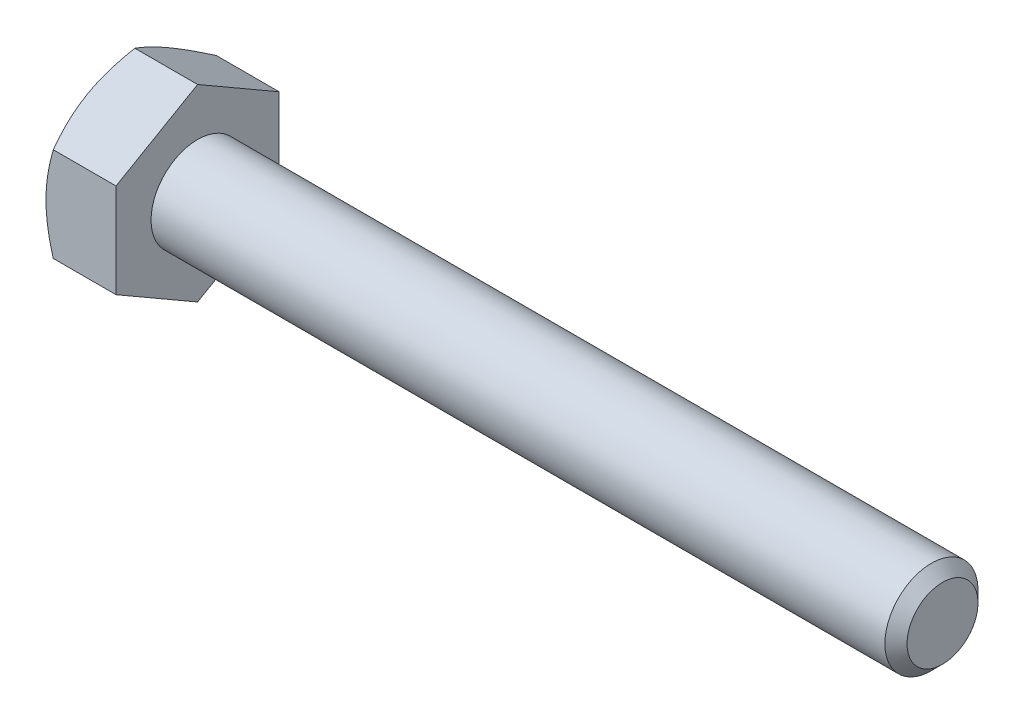
ISO-10303-21;
HEADER;
FILE_DESCRIPTION(('STEP AP214'),'2;1');
FILE_NAME('part.step','',(''),(''),'','','');
FILE_SCHEMA(('AUTOMOTIVE_DESIGN { 1 0 10303 214 1 1 1 1 }'));
ENDSEC;
DATA;
#1=APPLICATION_CONTEXT('core data for automotive mechanical design processes');
#2=APPLICATION_PROTOCOL_DEFINITION('international standard','automotive_design',2000,#1);
#3=PRODUCT_CONTEXT('',#1,'mechanical');
#4=PRODUCT('Part','Part','',(#3));
#5=PRODUCT_RELATED_PRODUCT_CATEGORY('part','',(#4));
#6=PRODUCT_DEFINITION_FORMATION('','',#4);
#7=PRODUCT_DEFINITION_CONTEXT('part definition',#1,'design');
#8=PRODUCT_DEFINITION('design','',#6,#7);
#9=PRODUCT_DEFINITION_SHAPE('','',#8);
#10=(LENGTH_UNIT() NAMED_UNIT(*) SI_UNIT(.MILLI.,.METRE.));
#11=(NAMED_UNIT(*) PLANE_ANGLE_UNIT() SI_UNIT($,.RADIAN.));
#12=(NAMED_UNIT(*) SI_UNIT($,.STERADIAN.) SOLID_ANGLE_UNIT());
#13=UNCERTAINTY_MEASURE_WITH_UNIT(LENGTH_MEASURE(1.E-05),#10,'distance_accuracy_value','');
#14=(GEOMETRIC_REPRESENTATION_CONTEXT(3) GLOBAL_UNCERTAINTY_ASSIGNED_CONTEXT((#13)) GLOBAL_UNIT_ASSIGNED_CONTEXT((#10,
#11,#12)) REPRESENTATION_CONTEXT('',''));
#15=CARTESIAN_POINT('',(0.,0.,0.));
#16=DIRECTION('',(0.,0.,1.));
#17=DIRECTION('',(1.,0.,0.));
#18=AXIS2_PLACEMENT_3D('',#15,#16,#17);
#19=CARTESIAN_POINT('',(4.7752,3.21156860739422,-5.5626));
#20=DIRECTION('',(0.,-0.866025403784438,0.500000000000001));
#21=DIRECTION('',(0.,-0.500000000000001,-0.866025403784438));
#22=AXIS2_PLACEMENT_3D('',#19,#20,#21);
#23=PLANE('',#22);
#24=CARTESIAN_POINT('',(0.496898061070141,6.42325268484227,0.000200000000000224));
#25=CARTESIAN_POINT('',(0.456146202255129,6.35265858120791,-0.12207257420949));
#26=CARTESIAN_POINT('',(0.417243775308722,6.2818012683745,-0.244801040124762));
#27=CARTESIAN_POINT('',(0.343647161560542,6.13951120287094,-0.491254662989243));
#28=CARTESIAN_POINT('',(0.308954790139044,6.06807821602766,-0.614980225538197));
#29=CARTESIAN_POINT('',(0.211873701066856,5.8526355064814,-0.98813794459262));
#30=CARTESIAN_POINT('',(0.156654841923375,5.7077753520137,-1.23904309212296));
#31=CARTESIAN_POINT('',(0.0919037861815303,5.49099476252076,-1.61451808721945));
#32=CARTESIAN_POINT('',(0.0734579983429364,5.419722058732,-1.7379660313744));
#33=CARTESIAN_POINT('',(0.0425268916674649,5.27685459691415,-1.98541973399132));
#34=CARTESIAN_POINT('',(0.0300410461890113,5.20525986790489,-2.10942544218948));
#35=CARTESIAN_POINT('',(0.011348029939474,5.06194605565758,-2.35765224642821));
#36=CARTESIAN_POINT('',(0.00513373340585016,4.99022720650591,-2.48187293701927));
#37=CARTESIAN_POINT('',(-0.000889599359092401,4.84672720555796,-2.7304222295473));
#38=CARTESIAN_POINT('',(-0.000698833448292997,4.7749460557547,-2.85475082803225));
#39=CARTESIAN_POINT('',(0.00862810136342634,4.57828637012707,-3.19537539533985));
#40=CARTESIAN_POINT('',(0.0242873955350792,4.45347220138351,-3.41155987710816));
#41=CARTESIAN_POINT('',(0.0739443233816081,4.20467287416474,-3.84249295274001));
#42=CARTESIAN_POINT('',(0.10795893142346,4.08068859075412,-4.05724003094723));
#43=CARTESIAN_POINT('',(0.192986041409678,3.83138850679899,-4.4890404426887));
#44=CARTESIAN_POINT('',(0.244358813937402,3.70610416511177,-4.70603928788379));
#45=CARTESIAN_POINT('',(0.360954456999593,3.45740388365366,-5.13680081122591));
#46=CARTESIAN_POINT('',(0.426149937617057,3.33398475856358,-5.35056900650764));
#47=CARTESIAN_POINT('',(0.496898061070136,3.21145313734038,-5.5628));
#48=B_SPLINE_CURVE_WITH_KNOTS('',3,(#24,#25,#26,#27,#28,#29,#30,#31,#32,#33,#34,#35,#36,#37,#38,
#39,#40,#41,#42,#43,#44,#45,#46,#47),.UNSPECIFIED.,.F.,.F.,(4,2,2,2,2,2,2,2,2,2,2,4),(0.,
0.44082011856227,0.881829648847399,1.76568130465016,2.19678242164486,2.62784543796583,
3.05841812523868,3.48897751176353,4.23854798324166,4.98881282275669,5.75571809391027,
6.52111769989992),.UNSPECIFIED.);
#49=CARTESIAN_POINT('',(0.496831392605786,6.42313721478843,0.));
#50=VERTEX_POINT('',#49);
#51=CARTESIAN_POINT('',(0.,4.81735291109132,-2.7813));
#52=VERTEX_POINT('',#51);
#53=EDGE_CURVE('E47',#50,#52,#48,.T.);
#54=ORIENTED_EDGE('',*,*,#53,.F.);
#55=DIRECTION('',(-1.,0.,0.));
#56=VECTOR('',#55,1.);
#57=CARTESIAN_POINT('',(4.7752,6.42313721478843,0.));
#58=LINE('',#57,#56);
#59=CARTESIAN_POINT('',(4.7752,6.42313721478843,0.));
#60=VERTEX_POINT('',#59);
#61=EDGE_CURVE('E143',#60,#50,#58,.T.);
#62=ORIENTED_EDGE('',*,*,#61,.F.);
#63=DIRECTION('',(0.,0.500000000000001,0.866025403784438));
#64=VECTOR('',#63,1.);
#65=CARTESIAN_POINT('',(4.7752,3.21156860739422,-5.5626));
#66=LINE('',#65,#64);
#67=CARTESIAN_POINT('',(4.7752,3.21156860739422,-5.5626));
#68=VERTEX_POINT('',#67);
#69=EDGE_CURVE('E228',#68,#60,#66,.T.);
#70=ORIENTED_EDGE('',*,*,#69,.F.);
#71=DIRECTION('',(-1.,0.,0.));
#72=VECTOR('',#71,1.);
#73=CARTESIAN_POINT('',(4.7752,3.21156860739422,-5.5626));
#74=LINE('',#73,#72);
#75=CARTESIAN_POINT('',(0.496831392605782,3.21156860739422,-5.5626));
#76=VERTEX_POINT('',#75);
#77=EDGE_CURVE('E131',#68,#76,#74,.T.);
#78=ORIENTED_EDGE('',*,*,#77,.T.);
#79=EDGE_CURVE('E125',#52,#76,#48,.T.);
#80=ORIENTED_EDGE('',*,*,#79,.F.);
#81=EDGE_LOOP('',(#54,#62,#70,#78,#80));
#82=FACE_BOUND('',#81,.T.);
#83=ADVANCED_FACE('F31',(#82),#23,.F.);
#84=CARTESIAN_POINT('',(4.7752,6.42313721478843,0.));
#85=DIRECTION('',(0.,-0.866025403784438,-0.500000000000002));
#86=DIRECTION('',(0.,0.500000000000002,-0.866025403784438));
#87=AXIS2_PLACEMENT_3D('',#84,#85,#86);
#88=PLANE('',#87);
#89=CARTESIAN_POINT('',(0.496898061070133,3.21145313734037,5.5628));
#90=CARTESIAN_POINT('',(0.456146202255122,3.28204724097473,5.44052742579051));
#91=CARTESIAN_POINT('',(0.417243775308715,3.35290455380814,5.31779895987524));
#92=CARTESIAN_POINT('',(0.343647161560536,3.49519461931171,5.07134533701076));
#93=CARTESIAN_POINT('',(0.308954790139038,3.56662760615498,4.94761977446181));
#94=CARTESIAN_POINT('',(0.21187370106685,3.78207031570124,4.57446205540738));
#95=CARTESIAN_POINT('',(0.156654841923369,3.92693047016895,4.32355690787704));
#96=CARTESIAN_POINT('',(0.0919037861815255,4.14371105966188,3.94808191278055));
#97=CARTESIAN_POINT('',(0.073457998342932,4.21498376345064,3.82463396862561));
#98=CARTESIAN_POINT('',(0.042526891667461,4.35785122526849,3.57718026600868));
#99=CARTESIAN_POINT('',(0.0300410461890077,4.42944595427775,3.45317455781053));
#100=CARTESIAN_POINT('',(0.0113480299394706,4.57275976652506,3.2049477535718));
#101=CARTESIAN_POINT('',(0.00513373340584675,4.64447861567674,3.08072706298073));
#102=CARTESIAN_POINT('',(-0.000889599359095246,4.78797861662468,2.83217777045271));
#103=CARTESIAN_POINT('',(-0.000698833448295297,4.85975976642794,2.70784917196776));
#104=CARTESIAN_POINT('',(0.00862810136342491,5.05641945205558,2.36722460466016));
#105=CARTESIAN_POINT('',(0.0242873955350777,5.18123362079913,2.15104012289185));
#106=CARTESIAN_POINT('',(0.0739443233816072,5.4300329480179,1.72010704725999));
#107=CARTESIAN_POINT('',(0.10795893142346,5.55401723142852,1.50535996905278));
#108=CARTESIAN_POINT('',(0.192986041409679,5.80331731538365,1.07355955731131));
#109=CARTESIAN_POINT('',(0.244358813937404,5.92860165707088,0.856560712116215));
#110=CARTESIAN_POINT('',(0.360954456999596,6.17730193852899,0.425799188774085));
#111=CARTESIAN_POINT('',(0.426149937617062,6.30072106361907,0.212030993492364));
#112=CARTESIAN_POINT('',(0.49689806107014,6.42325268484227,-0.000200000000000132));
#113=B_SPLINE_CURVE_WITH_KNOTS('',3,(#89,#90,#91,#92,#93,#94,#95,#96,#97,#98,#99,#100,#101,#102,
#103,#104,#105,#106,#107,#108,#109,#110,#111,#112),.UNSPECIFIED.,.F.,.F.,(4,2,2,2,2,2,2,2,2,2,2,
4),(0.,0.440820118562269,0.881829648847397,1.76568130465016,2.19678242164486,2.62784543796582,
3.05841812523867,3.48897751176352,4.23854798324166,4.98881282275669,5.75571809391027,
6.52111769989993),.UNSPECIFIED.);
#114=CARTESIAN_POINT('',(0.496831392605779,3.21156860739421,5.5626));
#115=VERTEX_POINT('',#114);
#116=CARTESIAN_POINT('',(0.,4.81735291109131,2.78130000000001));
#117=VERTEX_POINT('',#116);
#118=EDGE_CURVE('E54',#115,#117,#113,.T.);
#119=ORIENTED_EDGE('',*,*,#118,.F.);
#120=DIRECTION('',(-1.,0.,0.));
#121=VECTOR('',#120,1.);
#122=CARTESIAN_POINT('',(4.7752,3.21156860739421,5.5626));
#123=LINE('',#122,#121);
#124=CARTESIAN_POINT('',(4.7752,3.21156860739421,5.5626));
#125=VERTEX_POINT('',#124);
#126=EDGE_CURVE('E141',#125,#115,#123,.T.);
#127=ORIENTED_EDGE('',*,*,#126,.F.);
#128=DIRECTION('',(0.,-0.500000000000002,0.866025403784438));
#129=VECTOR('',#128,1.);
#130=CARTESIAN_POINT('',(4.7752,6.42313721478843,0.));
#131=LINE('',#130,#129);
#132=EDGE_CURVE('E226',#60,#125,#131,.T.);
#133=ORIENTED_EDGE('',*,*,#132,.F.);
#134=ORIENTED_EDGE('',*,*,#61,.T.);
#135=EDGE_CURVE('E158',#117,#50,#113,.T.);
#136=ORIENTED_EDGE('',*,*,#135,.F.);
#137=EDGE_LOOP('',(#119,#127,#133,#134,#136));
#138=FACE_BOUND('',#137,.T.);
#139=ADVANCED_FACE('F164',(#138),#88,.F.);
#140=CARTESIAN_POINT('',(4.7752,3.21156860739421,5.5626));
#141=DIRECTION('',(0.,0.,-1.));
#142=DIRECTION('',(-1.,0.,0.));
#143=AXIS2_PLACEMENT_3D('',#140,#141,#142);
#144=PLANE('',#143);
#145=CARTESIAN_POINT('',(2.76946298118782,-8.73931907134931,5.5626));
#146=CARTESIAN_POINT('',(2.65067477687312,-8.49536496294501,5.5626));
#147=CARTESIAN_POINT('',(2.53299354297043,-8.25086273134796,5.5626));
#148=CARTESIAN_POINT('',(2.30046552320844,-7.76047089715345,5.5626));
#149=CARTESIAN_POINT('',(2.18561916316987,-7.51458109286494,5.5626));
#150=CARTESIAN_POINT('',(1.95882765602869,-7.01990967591012,5.5626));
#151=CARTESIAN_POINT('',(1.8469007539214,-6.77111967039451,5.5626));
#152=CARTESIAN_POINT('',(1.62748022369643,-6.27159952720684,5.5626));
#153=CARTESIAN_POINT('',(1.51998639326666,-6.02086947869411,5.5626));
#154=CARTESIAN_POINT('',(1.30708686305049,-5.50862062515999,5.5626));
#155=CARTESIAN_POINT('',(1.2018721345633,-5.24702202730588,5.5626));
#156=CARTESIAN_POINT('',(0.999136458565246,-4.72080610690399,5.5626));
#157=CARTESIAN_POINT('',(0.901616358276679,-4.45618845560255,5.5626));
#158=CARTESIAN_POINT('',(0.716747076854945,-3.92397402586811,5.5626));
#159=CARTESIAN_POINT('',(0.629378259627784,-3.65638413416908,5.5626));
#160=CARTESIAN_POINT('',(0.467540995367509,-3.11736467394696,5.5626));
#161=CARTESIAN_POINT('',(0.393068603844491,-2.84593630702827,5.5626));
#162=CARTESIAN_POINT('',(0.260913640576693,-2.30059524037533,5.5626));
#163=CARTESIAN_POINT('',(0.203137923933975,-2.02670547196033,5.5626));
#164=CARTESIAN_POINT('',(0.107584140993967,-1.47536640605577,5.5626));
#165=CARTESIAN_POINT('',(0.0698039298235451,-1.19791749361912,5.5626));
#166=CARTESIAN_POINT('',(0.0306329033129858,-0.782024037078688,5.5626));
#167=CARTESIAN_POINT('',(0.0205033244370708,-0.644369603517935,5.5626));
#168=CARTESIAN_POINT('',(0.00607539249484359,-0.368760084714134,5.5626));
#169=CARTESIAN_POINT('',(0.00177648780683769,-0.230805029149019,5.5626));
#170=CARTESIAN_POINT('',(-0.000882415988902935,0.0451740110860139,5.5626));
#171=CARTESIAN_POINT('',(0.000758104200528384,0.183198000728069,5.5626));
#172=CARTESIAN_POINT('',(0.00993570123351354,0.459040077970874,5.5626));
#173=CARTESIAN_POINT('',(0.0174725517322404,0.596858173271909,5.5626));
#174=CARTESIAN_POINT('',(0.0422505226941668,0.924672766545116,5.5626));
#175=CARTESIAN_POINT('',(0.0620998981240928,1.11447655014998,5.5626));
#176=CARTESIAN_POINT('',(0.111925243451356,1.4927400577764,5.5626));
#177=CARTESIAN_POINT('',(0.141902492996067,1.68119960888143,5.5626));
#178=CARTESIAN_POINT('',(0.245441794558729,2.24430469004822,5.5626));
#179=CARTESIAN_POINT('',(0.332595181454091,2.61648783903801,5.5626));
#180=CARTESIAN_POINT('',(0.48458065668879,3.17327423069247,5.5626));
#181=CARTESIAN_POINT('',(0.539535147458601,3.36074033845107,5.5626));
#182=CARTESIAN_POINT('',(0.655361856953679,3.73385345225385,5.5626));
#183=CARTESIAN_POINT('',(0.716234120687394,3.91950044445067,5.5626));
#184=CARTESIAN_POINT('',(0.842902268347423,4.28903173945151,5.5626));
#185=CARTESIAN_POINT('',(0.908696733188384,4.47291653318725,5.5626));
#186=CARTESIAN_POINT('',(1.04441413237548,4.83914664715103,5.5626));
#187=CARTESIAN_POINT('',(1.11433697604311,5.02149200109188,5.5626));
#188=CARTESIAN_POINT('',(1.30616254116172,5.50788799936829,5.5626));
#189=CARTESIAN_POINT('',(1.43118964217262,5.81070521732177,5.5626));
#190=CARTESIAN_POINT('',(1.68847909791362,6.41326146392027,5.5626));
#191=CARTESIAN_POINT('',(1.82074222334612,6.7130001606208,5.5626));
#192=CARTESIAN_POINT('',(2.09080854329267,7.31009692856944,5.5626));
#193=CARTESIAN_POINT('',(2.22861377416227,7.60745407573435,5.5626));
#194=CARTESIAN_POINT('',(2.50845292532566,8.20015103027086,5.5626));
#195=CARTESIAN_POINT('',(2.65048668069892,8.49549091576861,5.5626));
#196=CARTESIAN_POINT('',(2.93809441051759,9.08501121024944,5.5626));
#197=CARTESIAN_POINT('',(3.08367358024023,9.37918907947538,5.5626));
#198=CARTESIAN_POINT('',(3.37748078740478,9.96621951539328,5.5626));
#199=CARTESIAN_POINT('',(3.5257088459301,10.2590720715134,5.5626));
#200=CARTESIAN_POINT('',(3.97349977739059,11.135883002068,5.5626));
#201=CARTESIAN_POINT('',(4.27623214013076,11.7182219913802,5.5626));
#202=CARTESIAN_POINT('',(4.85550678061971,12.8193647778853,5.5626));
#203=CARTESIAN_POINT('',(5.13148986685698,13.3384641726992,5.5626));
#204=CARTESIAN_POINT('',(5.68680572725546,14.3749069841369,5.5626));
#205=CARTESIAN_POINT('',(5.9661386999083,14.8922502943534,5.5626));
#206=CARTESIAN_POINT('',(6.52636532569113,15.9238879354023,5.5626));
#207=CARTESIAN_POINT('',(6.80725082971981,16.438186698545,5.5626));
#208=CARTESIAN_POINT('',(7.37092859091899,17.465687215985,5.5626));
#209=CARTESIAN_POINT('',(7.65372069975333,17.9788890516248,5.5626));
#210=CARTESIAN_POINT('',(7.9372077944748,18.4917042756102,5.5626));
#211=B_SPLINE_CURVE_WITH_KNOTS('',3,(#145,#146,#147,#148,#149,#150,#151,#152,#153,#154,#155,
#156,#157,#158,#159,#160,#161,#162,#163,#164,#165,#166,#167,#168,#169,#170,#171,#172,#173,#174,
#175,#176,#177,#178,#179,#180,#181,#182,#183,#184,#185,#186,#187,#188,#189,#190,#191,#192,#193,
#194,#195,#196,#197,#198,#199,#200,#201,#202,#203,#204,#205,#206,#207,#208,#209,#210),
.UNSPECIFIED.,.F.,.F.,(4,2,2,2,2,2,2,2,2,2,2,2,2,2,2,2,2,2,2,2,2,2,2,2,2,2,2,2,2,2,2,2,4),(0.,
0.814023059457574,1.62816765666496,2.44655638570204,3.26490772451191,4.1107076400708,
4.95660055342858,5.80082897227975,6.64479871831149,7.48396511452431,8.32304147698215,
8.73701667946677,9.15095271433075,9.56492494141958,9.97888127796807,10.5510771655991,
11.1233453766966,12.2684477407956,12.8544603586944,13.4404774339429,14.0263262050102,
14.6121621128824,15.5948602729039,16.577663303757,17.5608308091096,18.5439600191607,
19.52862868616,20.5133051939663,22.4822323595087,24.2459312012704,26.0097350693917,
27.7677407284947,29.5256111556825),.UNSPECIFIED.);
#212=CARTESIAN_POINT('',(0.496831392605786,-3.21156860739423,5.5626));
#213=VERTEX_POINT('',#212);
#214=CARTESIAN_POINT('',(0.,0.,5.5626));
#215=VERTEX_POINT('',#214);
#216=EDGE_CURVE('E238',#213,#215,#211,.T.);
#217=ORIENTED_EDGE('',*,*,#216,.F.);
#218=DIRECTION('',(-1.,0.,0.));
#219=VECTOR('',#218,1.);
#220=CARTESIAN_POINT('',(4.7752,-3.21156860739423,5.5626));
#221=LINE('',#220,#219);
#222=CARTESIAN_POINT('',(4.7752,-3.21156860739423,5.5626));
#223=VERTEX_POINT('',#222);
#224=EDGE_CURVE('E133',#223,#213,#221,.T.);
#225=ORIENTED_EDGE('',*,*,#224,.F.);
#226=DIRECTION('',(0.,-1.,0.));
#227=VECTOR('',#226,1.);
#228=CARTESIAN_POINT('',(4.7752,3.21156860739421,5.5626));
#229=LINE('',#228,#227);
#230=EDGE_CURVE('E222',#125,#223,#229,.T.);
#231=ORIENTED_EDGE('',*,*,#230,.F.);
#232=ORIENTED_EDGE('',*,*,#126,.T.);
#233=EDGE_CURVE('E180',#215,#115,#211,.T.);
#234=ORIENTED_EDGE('',*,*,#233,.F.);
#235=EDGE_LOOP('',(#217,#225,#231,#232,#234));
#236=FACE_BOUND('',#235,.T.);
#237=ADVANCED_FACE('F244',(#236),#144,.F.);
#238=CARTESIAN_POINT('',(4.7752,-6.42313721478844,0.));
#239=DIRECTION('',(0.,0.866025403784438,-0.5));
#240=DIRECTION('',(0.,0.5,0.866025403784439));
#241=AXIS2_PLACEMENT_3D('',#238,#239,#240);
#242=PLANE('',#241);
#243=CARTESIAN_POINT('',(0.496898061070147,-6.42325268484228,-0.000200000000000259));
#244=CARTESIAN_POINT('',(0.456146202255134,-6.35265858120792,0.122072574209491));
#245=CARTESIAN_POINT('',(0.417243775308727,-6.28180126837451,0.244801040124763));
#246=CARTESIAN_POINT('',(0.343647161560548,-6.13951120287095,0.491254662989245));
#247=CARTESIAN_POINT('',(0.30895479013905,-6.06807821602767,0.614980225538199));
#248=CARTESIAN_POINT('',(0.211873701066861,-5.85263550648141,0.988137944592622));
#249=CARTESIAN_POINT('',(0.15665484192338,-5.70777535201371,1.23904309212296));
#250=CARTESIAN_POINT('',(0.0919037861815359,-5.49099476252077,1.61451808721946));
#251=CARTESIAN_POINT('',(0.0734579983429419,-5.41972205873201,1.7379660313744));
#252=CARTESIAN_POINT('',(0.0425268916674702,-5.27685459691416,1.98541973399132));
#253=CARTESIAN_POINT('',(0.0300410461890166,-5.2052598679049,2.10942544218948));
#254=CARTESIAN_POINT('',(0.0113480299394794,-5.06194605565759,2.35765224642822));
#255=CARTESIAN_POINT('',(0.00513373340585577,-4.99022720650592,2.48187293701928));
#256=CARTESIAN_POINT('',(-0.000889599359086493,-4.84672720555797,2.73042222954731));
#257=CARTESIAN_POINT('',(-0.000698833448286953,-4.77494605575471,2.85475082803226));
#258=CARTESIAN_POINT('',(0.00862810136343261,-4.57828637012707,3.19537539533985));
#259=CARTESIAN_POINT('',(0.0242873955350853,-4.45347220138352,3.41155987710817));
#260=CARTESIAN_POINT('',(0.0739443233816138,-4.20467287416475,3.84249295274002));
#261=CARTESIAN_POINT('',(0.107958931423466,-4.08068859075413,4.05724003094723));
#262=CARTESIAN_POINT('',(0.192986041409683,-3.83138850679901,4.4890404426887));
#263=CARTESIAN_POINT('',(0.244358813937407,-3.70610416511178,4.70603928788379));
#264=CARTESIAN_POINT('',(0.360954456999598,-3.45740388365367,5.13680081122592));
#265=CARTESIAN_POINT('',(0.426149937617062,-3.33398475856359,5.35056900650764));
#266=CARTESIAN_POINT('',(0.49689806107014,-3.21145313734039,5.5628));
#267=B_SPLINE_CURVE_WITH_KNOTS('',3,(#243,#244,#245,#246,#247,#248,#249,#250,#251,#252,#253,
#254,#255,#256,#257,#258,#259,#260,#261,#262,#263,#264,#265,#266),.UNSPECIFIED.,.F.,.F.,(4,2,2,
2,2,2,2,2,2,2,2,4),(0.,0.440820118562271,0.881829648847401,1.76568130465017,2.19678242164487,
2.62784543796583,3.05841812523868,3.48897751176353,4.23854798324166,4.98881282275669,
5.75571809391027,6.52111769989992),.UNSPECIFIED.);
#268=CARTESIAN_POINT('',(0.496831392605792,-6.42313721478844,0.));
#269=VERTEX_POINT('',#268);
#270=CARTESIAN_POINT('',(0.,-4.81735291109132,2.7813));
#271=VERTEX_POINT('',#270);
#272=EDGE_CURVE('E166',#269,#271,#267,.T.);
#273=ORIENTED_EDGE('',*,*,#272,.F.);
#274=DIRECTION('',(-1.,0.,0.));
#275=VECTOR('',#274,1.);
#276=CARTESIAN_POINT('',(4.7752,-6.42313721478844,0.));
#277=LINE('',#276,#275);
#278=CARTESIAN_POINT('',(4.7752,-6.42313721478844,0.));
#279=VERTEX_POINT('',#278);
#280=EDGE_CURVE('E130',#279,#269,#277,.T.);
#281=ORIENTED_EDGE('',*,*,#280,.F.);
#282=DIRECTION('',(0.,-0.5,-0.866025403784438));
#283=VECTOR('',#282,1.);
#284=CARTESIAN_POINT('',(4.7752,-6.42313721478844,0.));
#285=LINE('',#284,#283);
#286=EDGE_CURVE('E220',#223,#279,#285,.T.);
#287=ORIENTED_EDGE('',*,*,#286,.F.);
#288=ORIENTED_EDGE('',*,*,#224,.T.);
#289=EDGE_CURVE('E168',#271,#213,#267,.T.);
#290=ORIENTED_EDGE('',*,*,#289,.F.);
#291=EDGE_LOOP('',(#273,#281,#287,#288,#290));
#292=FACE_BOUND('',#291,.T.);
#293=ADVANCED_FACE('F216',(#292),#242,.F.);
#294=CARTESIAN_POINT('',(4.7752,-3.21156860739422,-5.5626));
#295=DIRECTION('',(0.,0.866025403784438,0.500000000000001));
#296=DIRECTION('',(0.,-0.500000000000002,0.866025403784438));
#297=AXIS2_PLACEMENT_3D('',#294,#295,#296);
#298=PLANE('',#297);
#299=CARTESIAN_POINT('',(0.496898061070138,-3.21145313734038,-5.5628));
#300=CARTESIAN_POINT('',(0.456146202255126,-3.28204724097474,-5.44052742579051));
#301=CARTESIAN_POINT('',(0.417243775308719,-3.35290455380815,-5.31779895987524));
#302=CARTESIAN_POINT('',(0.34364716156054,-3.49519461931172,-5.07134533701076));
#303=CARTESIAN_POINT('',(0.308954790139042,-3.56662760615499,-4.94761977446181));
#304=CARTESIAN_POINT('',(0.211873701066854,-3.78207031570125,-4.57446205540738));
#305=CARTESIAN_POINT('',(0.156654841923374,-3.92693047016896,-4.32355690787704));
#306=CARTESIAN_POINT('',(0.0919037861815304,-4.14371105966189,-3.94808191278055));
#307=CARTESIAN_POINT('',(0.0734579983429368,-4.21498376345065,-3.82463396862561));
#308=CARTESIAN_POINT('',(0.0425268916674659,-4.35785122526851,-3.57718026600868));
#309=CARTESIAN_POINT('',(0.0300410461890129,-4.42944595427776,-3.45317455781052));
#310=CARTESIAN_POINT('',(0.0113480299394763,-4.57275976652507,-3.20494775357179));
#311=CARTESIAN_POINT('',(0.00513373340585269,-4.64447861567675,-3.08072706298073));
#312=CARTESIAN_POINT('',(-0.000889599359089418,-4.78797861662469,-2.8321777704527));
#313=CARTESIAN_POINT('',(-0.000698833448289728,-4.85975976642795,-2.70784917196775));
#314=CARTESIAN_POINT('',(0.0086281013634303,-5.05641945205559,-2.36722460466016));
#315=CARTESIAN_POINT('',(0.0242873955350835,-5.18123362079915,-2.15104012289184));
#316=CARTESIAN_POINT('',(0.0739443233816137,-5.43003294801791,-1.72010704725999));
#317=CARTESIAN_POINT('',(0.107958931423467,-5.55401723142853,-1.50535996905278));
#318=CARTESIAN_POINT('',(0.192986041409686,-5.80331731538366,-1.0735595573113));
#319=CARTESIAN_POINT('',(0.24435881393741,-5.92860165707089,-0.856560712116214));
#320=CARTESIAN_POINT('',(0.360954456999602,-6.177301938529,-0.425799188774084));
#321=CARTESIAN_POINT('',(0.426149937617067,-6.30072106361908,-0.212030993492364));
#322=CARTESIAN_POINT('',(0.496898061070146,-6.42325268484228,0.000199999999999854));
#323=B_SPLINE_CURVE_WITH_KNOTS('',3,(#299,#300,#301,#302,#303,#304,#305,#306,#307,#308,#309,
#310,#311,#312,#313,#314,#315,#316,#317,#318,#319,#320,#321,#322),.UNSPECIFIED.,.F.,.F.,(4,2,2,
2,2,2,2,2,2,2,2,4),(0.,0.44082011856227,0.881829648847399,1.76568130465016,2.19678242164486,
2.62784543796583,3.05841812523868,3.48897751176352,4.23854798324166,4.98881282275669,
5.75571809391027,6.52111769989993),.UNSPECIFIED.);
#324=CARTESIAN_POINT('',(0.496831392605575,-3.21156860739453,-5.5626));
#325=VERTEX_POINT('',#324);
#326=CARTESIAN_POINT('',(0.,-4.81735291109131,-2.78130000000001));
#327=VERTEX_POINT('',#326);
#328=EDGE_CURVE('E107',#325,#327,#323,.T.);
#329=ORIENTED_EDGE('',*,*,#328,.F.);
#330=DIRECTION('',(-1.,0.,0.));
#331=VECTOR('',#330,1.);
#332=CARTESIAN_POINT('',(4.7752,-3.21156860739422,-5.5626));
#333=LINE('',#332,#331);
#334=CARTESIAN_POINT('',(4.7752,-3.21156860739422,-5.5626));
#335=VERTEX_POINT('',#334);
#336=EDGE_CURVE('E121',#335,#325,#333,.T.);
#337=ORIENTED_EDGE('',*,*,#336,.F.);
#338=DIRECTION('',(0.,0.500000000000001,-0.866025403784438));
#339=VECTOR('',#338,1.);
#340=CARTESIAN_POINT('',(4.7752,-3.21156860739422,-5.5626));
#341=LINE('',#340,#339);
#342=EDGE_CURVE('E218',#279,#335,#341,.T.);
#343=ORIENTED_EDGE('',*,*,#342,.F.);
#344=ORIENTED_EDGE('',*,*,#280,.T.);
#345=EDGE_CURVE('E124',#327,#269,#323,.T.);
#346=ORIENTED_EDGE('',*,*,#345,.F.);
#347=EDGE_LOOP('',(#329,#337,#343,#344,#346));
#348=FACE_BOUND('',#347,.T.);
#349=ADVANCED_FACE('F119',(#348),#298,.F.);
#350=CARTESIAN_POINT('',(4.7752,3.21156860739422,-5.5626));
#351=DIRECTION('',(0.,0.,1.));
#352=DIRECTION('',(0.,-1.,0.));
#353=AXIS2_PLACEMENT_3D('',#350,#351,#352);
#354=PLANE('',#353);
#355=CARTESIAN_POINT('',(2.76946298300577,-8.73931907508183,-5.5626));
#356=CARTESIAN_POINT('',(2.65067477861527,-8.49536496655188,-5.5626));
#357=CARTESIAN_POINT('',(2.53299354463682,-8.2508627348291,-5.5626));
#358=CARTESIAN_POINT('',(2.30046552472367,-7.76047090038273,-5.5626));
#359=CARTESIAN_POINT('',(2.18561916460971,-7.51458109596809,-5.5626));
#360=CARTESIAN_POINT('',(1.9588276573177,-7.01990967875913,-5.5626));
#361=CARTESIAN_POINT('',(1.84690075513499,-6.77111967311548,-5.5626));
#362=CARTESIAN_POINT('',(1.62748022476041,-6.27159952967088,-5.5626));
#363=CARTESIAN_POINT('',(1.51998639425647,-6.02086948102925,-5.5626));
#364=CARTESIAN_POINT('',(1.30708686388974,-5.50862062722724,-5.5626));
#365=CARTESIAN_POINT('',(1.20187213532634,-5.24702202923406,-5.5626));
#366=CARTESIAN_POINT('',(0.999136459179914,-4.72080610855179,-5.5626));
#367=CARTESIAN_POINT('',(0.901616358819185,-4.45618845710904,-5.5626));
#368=CARTESIAN_POINT('',(0.716747077259984,-3.92397402708937,-5.5626));
#369=CARTESIAN_POINT('',(0.629378259967497,-3.65638413524644,-5.5626));
#370=CARTESIAN_POINT('',(0.467540995587164,-3.11736467473259,-5.5626));
#371=CARTESIAN_POINT('',(0.393068604009406,-2.84593630766609,-5.5626));
#372=CARTESIAN_POINT('',(0.26091364063106,-2.3005952406421,-5.5626));
#373=CARTESIAN_POINT('',(0.203137923936714,-2.02670547200285,-5.5626));
#374=CARTESIAN_POINT('',(0.107584140927261,-1.47536640564425,-5.5626));
#375=CARTESIAN_POINT('',(0.0698039297389962,-1.19791749297779,-5.5626));
#376=CARTESIAN_POINT('',(0.0306329032322222,-0.782024036094229,-5.5626));
#377=CARTESIAN_POINT('',(0.0205033243625265,-0.64436960242076,-5.5626));
#378=CARTESIAN_POINT('',(0.00607539244269948,-0.368760083391739,-5.5626));
#379=CARTESIAN_POINT('',(0.00177648777087262,-0.23080502771412,-5.5626));
#380=CARTESIAN_POINT('',(-0.000882415982738095,0.0451740127451188,-5.5626));
#381=CARTESIAN_POINT('',(0.0007581042326474,0.183198002498876,-5.5626));
#382=CARTESIAN_POINT('',(0.0099357013266247,0.459040079963613,-5.5626));
#383=CARTESIAN_POINT('',(0.0174725518603889,0.596858175374878,-5.5626));
#384=CARTESIAN_POINT('',(0.0422505229084566,0.92467276881753,-5.5626));
#385=CARTESIAN_POINT('',(0.0620998983879048,1.11447655248113,-5.5626));
#386=CARTESIAN_POINT('',(0.11192524381685,1.49274006022233,-5.5626));
#387=CARTESIAN_POINT('',(0.14190249341372,1.68119961138341,-5.5626));
#388=CARTESIAN_POINT('',(0.245441795133938,2.24430469271528,-5.5626));
#389=CARTESIAN_POINT('',(0.332595182135704,2.61648784181075,-5.5626));
#390=CARTESIAN_POINT('',(0.484580657527373,3.17327423362328,-5.5626));
#391=CARTESIAN_POINT('',(0.539535148349868,3.36074034143571,-5.5626));
#392=CARTESIAN_POINT('',(0.655361857948683,3.73385345534553,-5.5626));
#393=CARTESIAN_POINT('',(0.716234121733453,3.91950044759558,-5.5626));
#394=CARTESIAN_POINT('',(0.842902269493741,4.28903174270244,-5.5626));
#395=CARTESIAN_POINT('',(0.908696734383905,4.47291653649101,-5.5626));
#396=CARTESIAN_POINT('',(1.04441413366768,4.83914665056043,-5.5626));
#397=CARTESIAN_POINT('',(1.11433697738278,5.0214920045541,-5.5626));
#398=CARTESIAN_POINT('',(1.30616254258249,5.50788800286084,-5.5626));
#399=CARTESIAN_POINT('',(1.43118964362202,5.81070522079334,-5.5626));
#400=CARTESIAN_POINT('',(1.68847909941209,6.41326146735259,-5.5626));
#401=CARTESIAN_POINT('',(1.82074222486501,6.71300016403483,-5.5626));
#402=CARTESIAN_POINT('',(2.09080854484644,7.31009693194886,-5.5626));
#403=CARTESIAN_POINT('',(2.22861377573049,7.60745407909743,-5.5626));
#404=CARTESIAN_POINT('',(2.50845292691854,8.20015103360303,-5.5626));
#405=CARTESIAN_POINT('',(2.65048668230202,8.4954909190862,-5.5626));
#406=CARTESIAN_POINT('',(2.9380944121376,9.08501121353834,-5.5626));
#407=CARTESIAN_POINT('',(3.08367358186692,9.37918908275016,-5.5626));
#408=CARTESIAN_POINT('',(3.37748078904248,9.96621951864088,-5.5626));
#409=CARTESIAN_POINT('',(3.52570884757213,10.2590720747479,-5.5626));
#410=CARTESIAN_POINT('',(3.97349977904315,11.1358830052649,-5.5626));
#411=CARTESIAN_POINT('',(4.2762321417869,11.7182219945537,-5.5626));
#412=CARTESIAN_POINT('',(4.85550678228879,12.8193647810355,-5.5626));
#413=CARTESIAN_POINT('',(5.131489868536,13.3384641758493,-5.5626));
#414=CARTESIAN_POINT('',(5.6868057289523,14.3749069872876,-5.5626));
#415=CARTESIAN_POINT('',(5.96613870161304,14.8922502975048,-5.5626));
#416=CARTESIAN_POINT('',(6.52636532741206,15.9238879385592,-5.5626));
#417=CARTESIAN_POINT('',(6.80725083144904,16.4381867017066,-5.5626));
#418=CARTESIAN_POINT('',(7.37092859266391,17.4656872191565,-5.5626));
#419=CARTESIAN_POINT('',(7.65372070150564,17.9788890548016,-5.5626));
#420=CARTESIAN_POINT('',(7.93720779623419,18.4917042787925,-5.5626));
#421=B_SPLINE_CURVE_WITH_KNOTS('',3,(#355,#356,#357,#358,#359,#360,#361,#362,#363,#364,#365,
#366,#367,#368,#369,#370,#371,#372,#373,#374,#375,#376,#377,#378,#379,#380,#381,#382,#383,#384,
#385,#386,#387,#388,#389,#390,#391,#392,#393,#394,#395,#396,#397,#398,#399,#400,#401,#402,#403,
#404,#405,#406,#407,#408,#409,#410,#411,#412,#413,#414,#415,#416,#417,#418,#419,#420),
.UNSPECIFIED.,.F.,.F.,(4,2,2,2,2,2,2,2,2,2,2,2,2,2,2,2,2,2,2,2,2,2,2,2,2,2,2,2,2,2,2,2,4),(0.,
0.814023059896038,1.62816765754195,2.44655638702216,3.26490772627512,4.11070764230638,
4.95660055613668,5.80082897545884,6.6447987219612,7.48396511886283,8.32304148200849,
8.7370166848287,9.15095272002818,9.56492494745272,9.97888128433687,10.5510771721585,
11.1233453834466,12.2684477479277,12.854460366026,13.4404774414739,14.0263262127402,
14.6121621208114,15.5948602808078,16.5776633116357,17.5608308169621,18.5439600269871,
19.5286286939574,20.5133052017347,22.4822323672198,24.2459312089951,26.0097350771297,
27.7677407362569,29.5256111634694),.UNSPECIFIED.);
#422=CARTESIAN_POINT('',(0.,0.,-5.5626));
#423=VERTEX_POINT('',#422);
#424=EDGE_CURVE('E113',#76,#423,#421,.F.);
#425=ORIENTED_EDGE('',*,*,#424,.F.);
#426=ORIENTED_EDGE('',*,*,#77,.F.);
#427=DIRECTION('',(0.,1.,0.));
#428=VECTOR('',#427,1.);
#429=CARTESIAN_POINT('',(4.7752,3.21156860739422,-5.5626));
#430=LINE('',#429,#428);
#431=EDGE_CURVE('E129',#335,#68,#430,.T.);
#432=ORIENTED_EDGE('',*,*,#431,.F.);
#433=ORIENTED_EDGE('',*,*,#336,.T.);
#434=EDGE_CURVE('E104',#423,#325,#421,.F.);
#435=ORIENTED_EDGE('',*,*,#434,.F.);
#436=EDGE_LOOP('',(#425,#426,#432,#433,#435));
#437=FACE_BOUND('',#436,.T.);
#438=ADVANCED_FACE('F127',(#437),#354,.F.);
#439=CARTESIAN_POINT('',(4.7752,6.42313721478843,0.));
#440=DIRECTION('',(1.,0.,0.));
#441=DIRECTION('',(0.,0.,-1.));
#442=AXIS2_PLACEMENT_3D('',#439,#440,#441);
#443=PLANE('',#442);
#444=ORIENTED_EDGE('',*,*,#69,.T.);
#445=ORIENTED_EDGE('',*,*,#132,.T.);
#446=ORIENTED_EDGE('',*,*,#230,.T.);
#447=ORIENTED_EDGE('',*,*,#286,.T.);
#448=ORIENTED_EDGE('',*,*,#342,.T.);
#449=ORIENTED_EDGE('',*,*,#431,.T.);
#450=EDGE_LOOP('',(#444,#445,#446,#447,#448,#449));
#451=FACE_BOUND('',#450,.T.);
#452=CARTESIAN_POINT('',(4.7752,0.,0.));
#453=DIRECTION('',(1.,0.,0.));
#454=DIRECTION('',(0.,0.,-1.));
#455=AXIS2_PLACEMENT_3D('',#452,#453,#454);
#456=CIRCLE('',#455,3.175);
#457=CARTESIAN_POINT('',(4.7752,0.,-3.175));
#458=VERTEX_POINT('',#457);
#459=EDGE_CURVE('E231',#458,#458,#456,.F.);
#460=ORIENTED_EDGE('',*,*,#459,.T.);
#461=EDGE_LOOP('',(#460));
#462=FACE_BOUND('',#461,.T.);
#463=ADVANCED_FACE('F246',(#451,#462),#443,.T.);
#464=CARTESIAN_POINT('',(0.,0.,0.));
#465=DIRECTION('',(-1.,0.,0.));
#466=DIRECTION('',(0.,0.,1.));
#467=AXIS2_PLACEMENT_3D('',#464,#465,#466);
#468=CYLINDRICAL_SURFACE('',#467,3.175);
#469=ORIENTED_EDGE('',*,*,#459,.F.);
#470=EDGE_LOOP('',(#469));
#471=FACE_BOUND('',#470,.T.);
#472=CARTESIAN_POINT('',(54.81955,0.,0.));
#473=DIRECTION('',(-1.,0.,0.));
#474=DIRECTION('',(0.,0.,1.));
#475=AXIS2_PLACEMENT_3D('',#472,#473,#474);
#476=CIRCLE('',#475,3.175);
#477=CARTESIAN_POINT('',(54.81955,0.,3.175));
#478=VERTEX_POINT('',#477);
#479=EDGE_CURVE('E234',#478,#478,#476,.T.);
#480=ORIENTED_EDGE('',*,*,#479,.T.);
#481=EDGE_LOOP('',(#480));
#482=FACE_BOUND('',#481,.T.);
#483=ADVANCED_FACE('F278',(#471,#482),#468,.T.);
#484=CARTESIAN_POINT('',(55.5752,0.,0.));
#485=DIRECTION('',(-1.,0.,0.));
#486=DIRECTION('',(0.,0.,1.));
#487=AXIS2_PLACEMENT_3D('',#484,#485,#486);
#488=CONICAL_SURFACE('',#487,2.41935,0.785398163397446);
#489=ORIENTED_EDGE('',*,*,#479,.F.);
#490=EDGE_LOOP('',(#489));
#491=FACE_BOUND('',#490,.T.);
#492=CARTESIAN_POINT('',(55.5752,0.,0.));
#493=DIRECTION('',(-1.,0.,0.));
#494=DIRECTION('',(0.,0.,1.));
#495=AXIS2_PLACEMENT_3D('',#492,#493,#494);
#496=CIRCLE('',#495,2.41935);
#497=CARTESIAN_POINT('',(55.5752,0.,2.41935));
#498=VERTEX_POINT('',#497);
#499=EDGE_CURVE('E236',#498,#498,#496,.T.);
#500=ORIENTED_EDGE('',*,*,#499,.T.);
#501=EDGE_LOOP('',(#500));
#502=FACE_BOUND('',#501,.T.);
#503=ADVANCED_FACE('F280',(#491,#502),#488,.T.);
#504=CARTESIAN_POINT('',(55.5752,0.,0.));
#505=DIRECTION('',(-1.,0.,0.));
#506=DIRECTION('',(0.,0.,1.));
#507=AXIS2_PLACEMENT_3D('',#504,#505,#506);
#508=PLANE('',#507);
#509=ORIENTED_EDGE('',*,*,#499,.F.);
#510=EDGE_LOOP('',(#509));
#511=FACE_BOUND('',#510,.T.);
#512=ADVANCED_FACE('F193',(#511),#508,.F.);
#513=CARTESIAN_POINT('',(0.,0.,0.));
#514=DIRECTION('',(1.,0.,0.));
#515=DIRECTION('',(0.,0.,-1.));
#516=AXIS2_PLACEMENT_3D('',#513,#514,#515);
#517=CONICAL_SURFACE('',#516,5.5626,1.0471975511966);
#518=ORIENTED_EDGE('',*,*,#328,.T.);
#519=CARTESIAN_POINT('',(0.,0.,0.));
#520=DIRECTION('',(1.,0.,0.));
#521=DIRECTION('',(0.,0.,-1.));
#522=AXIS2_PLACEMENT_3D('',#519,#520,#521);
#523=CIRCLE('',#522,5.5626);
#524=EDGE_CURVE('E35',#327,#423,#523,.T.);
#525=ORIENTED_EDGE('',*,*,#524,.T.);
#526=ORIENTED_EDGE('',*,*,#434,.T.);
#527=EDGE_LOOP('',(#518,#525,#526));
#528=FACE_BOUND('',#527,.T.);
#529=ADVANCED_FACE('F106',(#528),#517,.T.);
#530=ORIENTED_EDGE('',*,*,#272,.T.);
#531=EDGE_CURVE('E148',#271,#327,#523,.T.);
#532=ORIENTED_EDGE('',*,*,#531,.T.);
#533=ORIENTED_EDGE('',*,*,#345,.T.);
#534=EDGE_LOOP('',(#530,#532,#533));
#535=FACE_BOUND('',#534,.T.);
#536=ADVANCED_FACE('F192',(#535),#517,.T.);
#537=ORIENTED_EDGE('',*,*,#216,.T.);
#538=EDGE_CURVE('E149',#215,#271,#523,.T.);
#539=ORIENTED_EDGE('',*,*,#538,.T.);
#540=ORIENTED_EDGE('',*,*,#289,.T.);
#541=EDGE_LOOP('',(#537,#539,#540));
#542=FACE_BOUND('',#541,.T.);
#543=ADVANCED_FACE('F187',(#542),#517,.T.);
#544=ORIENTED_EDGE('',*,*,#233,.T.);
#545=ORIENTED_EDGE('',*,*,#118,.T.);
#546=CARTESIAN_POINT('',(0.,0.,0.));
#547=DIRECTION('',(-1.,0.,0.));
#548=DIRECTION('',(0.,0.,1.));
#549=AXIS2_PLACEMENT_3D('',#546,#547,#548);
#550=CIRCLE('',#549,5.5626);
#551=EDGE_CURVE('E114',#215,#117,#550,.T.);
#552=ORIENTED_EDGE('',*,*,#551,.F.);
#553=EDGE_LOOP('',(#544,#545,#552));
#554=FACE_BOUND('',#553,.T.);
#555=ADVANCED_FACE('F191',(#554),#517,.T.);
#556=ORIENTED_EDGE('',*,*,#135,.T.);
#557=ORIENTED_EDGE('',*,*,#53,.T.);
#558=EDGE_CURVE('E40',#52,#117,#523,.T.);
#559=ORIENTED_EDGE('',*,*,#558,.T.);
#560=EDGE_LOOP('',(#556,#557,#559));
#561=FACE_BOUND('',#560,.T.);
#562=ADVANCED_FACE('F157',(#561),#517,.T.);
#563=ORIENTED_EDGE('',*,*,#79,.T.);
#564=ORIENTED_EDGE('',*,*,#424,.T.);
#565=EDGE_CURVE('E11',#423,#52,#523,.T.);
#566=ORIENTED_EDGE('',*,*,#565,.T.);
#567=EDGE_LOOP('',(#563,#564,#566));
#568=FACE_BOUND('',#567,.T.);
#569=ADVANCED_FACE('F250',(#568),#517,.T.);
#570=CARTESIAN_POINT('',(0.,6.42313721478843,0.));
#571=DIRECTION('',(1.,0.,0.));
#572=DIRECTION('',(0.,0.,-1.));
#573=AXIS2_PLACEMENT_3D('',#570,#571,#572);
#574=PLANE('',#573);
#575=ORIENTED_EDGE('',*,*,#565,.F.);
#576=ORIENTED_EDGE('',*,*,#524,.F.);
#577=ORIENTED_EDGE('',*,*,#531,.F.);
#578=ORIENTED_EDGE('',*,*,#538,.F.);
#579=ORIENTED_EDGE('',*,*,#551,.T.);
#580=ORIENTED_EDGE('',*,*,#558,.F.);
#581=EDGE_LOOP('',(#575,#576,#577,#578,#579,#580));
#582=FACE_BOUND('',#581,.T.);
#583=ADVANCED_FACE('F161',(#582),#574,.F.);
#584=CLOSED_SHELL('',(#83,#139,#237,#293,#349,#438,#463,#483,#503,#512,#529,#536,#543,#555,#562,
#569,#583));
#585=MANIFOLD_SOLID_BREP('B2',#584);
#586=ADVANCED_BREP_SHAPE_REPRESENTATION('',(#18,#585),#14);
#587=SHAPE_DEFINITION_REPRESENTATION(#9,#586);
ENDSEC;
END-ISO-10303-21;
